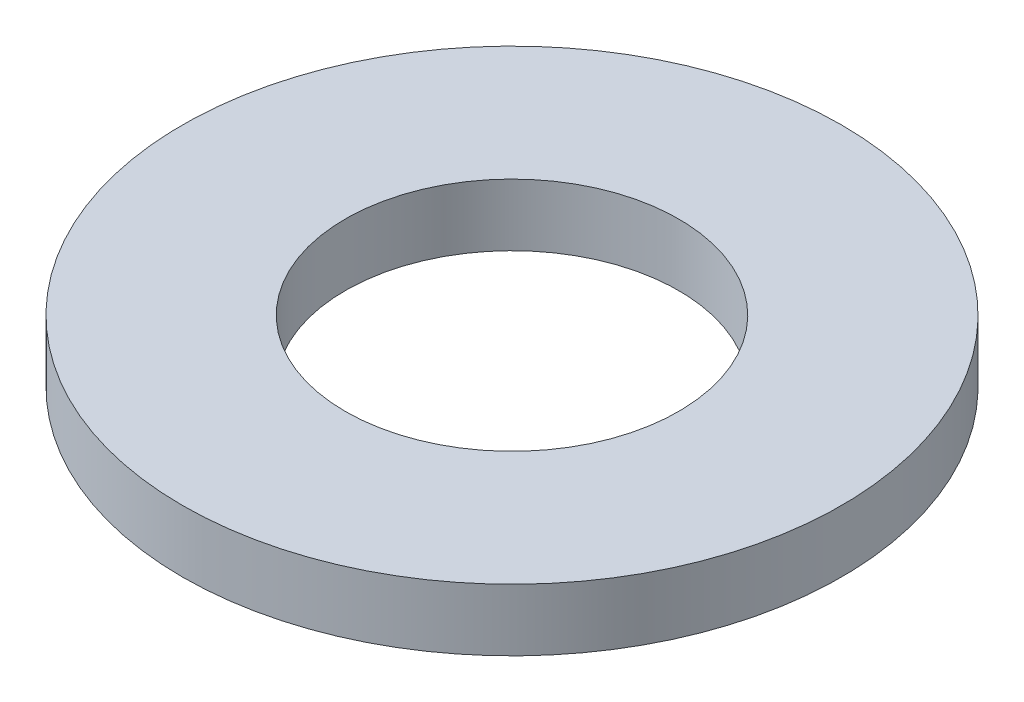
ISO-10303-21;
HEADER;
FILE_DESCRIPTION(('STEP AP214'),'2;1');
FILE_NAME('part.step','',(''),(''),'','','');
FILE_SCHEMA(('AUTOMOTIVE_DESIGN { 1 0 10303 214 1 1 1 1 }'));
ENDSEC;
DATA;
#1=APPLICATION_CONTEXT('core data for automotive mechanical design processes');
#2=APPLICATION_PROTOCOL_DEFINITION('international standard','automotive_design',2000,#1);
#3=PRODUCT_CONTEXT('',#1,'mechanical');
#4=PRODUCT('Part','Part','',(#3));
#5=PRODUCT_RELATED_PRODUCT_CATEGORY('part','',(#4));
#6=PRODUCT_DEFINITION_FORMATION('','',#4);
#7=PRODUCT_DEFINITION_CONTEXT('part definition',#1,'design');
#8=PRODUCT_DEFINITION('design','',#6,#7);
#9=PRODUCT_DEFINITION_SHAPE('','',#8);
#10=(LENGTH_UNIT() NAMED_UNIT(*) SI_UNIT(.MILLI.,.METRE.));
#11=(NAMED_UNIT(*) PLANE_ANGLE_UNIT() SI_UNIT($,.RADIAN.));
#12=(NAMED_UNIT(*) SI_UNIT($,.STERADIAN.) SOLID_ANGLE_UNIT());
#13=UNCERTAINTY_MEASURE_WITH_UNIT(LENGTH_MEASURE(1.E-05),#10,'distance_accuracy_value','');
#14=(GEOMETRIC_REPRESENTATION_CONTEXT(3) GLOBAL_UNCERTAINTY_ASSIGNED_CONTEXT((#13)) GLOBAL_UNIT_ASSIGNED_CONTEXT((#10,
#11,#12)) REPRESENTATION_CONTEXT('',''));
#15=CARTESIAN_POINT('',(0.,0.,0.));
#16=DIRECTION('',(0.,0.,1.));
#17=DIRECTION('',(1.,0.,0.));
#18=AXIS2_PLACEMENT_3D('',#15,#16,#17);
#19=CARTESIAN_POINT('',(0.,0.8,0.));
#20=DIRECTION('',(0.,1.,0.));
#21=DIRECTION('',(0.,0.,1.));
#22=AXIS2_PLACEMENT_3D('',#19,#20,#21);
#23=PLANE('',#22);
#24=CARTESIAN_POINT('',(0.,0.8,0.));
#25=DIRECTION('',(0.,1.,0.));
#26=DIRECTION('',(0.,0.,1.));
#27=AXIS2_PLACEMENT_3D('',#24,#25,#26);
#28=CIRCLE('',#27,4.25);
#29=CARTESIAN_POINT('',(0.,0.8,4.25));
#30=VERTEX_POINT('',#29);
#31=EDGE_CURVE('E10',#30,#30,#28,.T.);
#32=ORIENTED_EDGE('',*,*,#31,.T.);
#33=EDGE_LOOP('',(#32));
#34=FACE_BOUND('',#33,.T.);
#35=CARTESIAN_POINT('',(0.,0.8,0.));
#36=DIRECTION('',(0.,1.,0.));
#37=DIRECTION('',(0.,0.,1.));
#38=AXIS2_PLACEMENT_3D('',#35,#36,#37);
#39=CIRCLE('',#38,2.15);
#40=CARTESIAN_POINT('',(0.,0.8,2.15));
#41=VERTEX_POINT('',#40);
#42=EDGE_CURVE('E44',#41,#41,#39,.T.);
#43=ORIENTED_EDGE('',*,*,#42,.F.);
#44=EDGE_LOOP('',(#43));
#45=FACE_BOUND('',#44,.T.);
#46=ADVANCED_FACE('F33',(#34,#45),#23,.T.);
#47=CARTESIAN_POINT('',(0.,0.,0.));
#48=DIRECTION('',(0.,1.,0.));
#49=DIRECTION('',(0.,0.,1.));
#50=AXIS2_PLACEMENT_3D('',#47,#48,#49);
#51=PLANE('',#50);
#52=CARTESIAN_POINT('',(0.,0.,0.));
#53=DIRECTION('',(0.,1.,0.));
#54=DIRECTION('',(0.,0.,1.));
#55=AXIS2_PLACEMENT_3D('',#52,#53,#54);
#56=CIRCLE('',#55,4.25);
#57=CARTESIAN_POINT('',(0.,0.,4.25));
#58=VERTEX_POINT('',#57);
#59=EDGE_CURVE('E37',#58,#58,#56,.T.);
#60=ORIENTED_EDGE('',*,*,#59,.F.);
#61=EDGE_LOOP('',(#60));
#62=FACE_BOUND('',#61,.T.);
#63=CARTESIAN_POINT('',(0.,0.,0.));
#64=DIRECTION('',(0.,1.,0.));
#65=DIRECTION('',(0.,0.,1.));
#66=AXIS2_PLACEMENT_3D('',#63,#64,#65);
#67=CIRCLE('',#66,2.15);
#68=CARTESIAN_POINT('',(0.,0.,2.15));
#69=VERTEX_POINT('',#68);
#70=EDGE_CURVE('E46',#69,#69,#67,.T.);
#71=ORIENTED_EDGE('',*,*,#70,.T.);
#72=EDGE_LOOP('',(#71));
#73=FACE_BOUND('',#72,.T.);
#74=ADVANCED_FACE('F56',(#62,#73),#51,.F.);
#75=CARTESIAN_POINT('',(0.,0.8,0.));
#76=DIRECTION('',(0.,-1.,0.));
#77=DIRECTION('',(0.,0.,-1.));
#78=AXIS2_PLACEMENT_3D('',#75,#76,#77);
#79=CYLINDRICAL_SURFACE('',#78,4.25);
#80=ORIENTED_EDGE('',*,*,#31,.F.);
#81=EDGE_LOOP('',(#80));
#82=FACE_BOUND('',#81,.T.);
#83=ORIENTED_EDGE('',*,*,#59,.T.);
#84=EDGE_LOOP('',(#83));
#85=FACE_BOUND('',#84,.T.);
#86=ADVANCED_FACE('F35',(#82,#85),#79,.T.);
#87=CARTESIAN_POINT('',(0.,0.8,0.));
#88=DIRECTION('',(0.,-1.,0.));
#89=DIRECTION('',(0.,0.,-1.));
#90=AXIS2_PLACEMENT_3D('',#87,#88,#89);
#91=CYLINDRICAL_SURFACE('',#90,2.15);
#92=ORIENTED_EDGE('',*,*,#42,.T.);
#93=EDGE_LOOP('',(#92));
#94=FACE_BOUND('',#93,.T.);
#95=ORIENTED_EDGE('',*,*,#70,.F.);
#96=EDGE_LOOP('',(#95));
#97=FACE_BOUND('',#96,.T.);
#98=ADVANCED_FACE('F52',(#94,#97),#91,.F.);
#99=CLOSED_SHELL('',(#46,#74,#86,#98));
#100=MANIFOLD_SOLID_BREP('B2',#99);
#101=ADVANCED_BREP_SHAPE_REPRESENTATION('',(#18,#100),#14);
#102=SHAPE_DEFINITION_REPRESENTATION(#9,#101);
ENDSEC;
END-ISO-10303-21;
